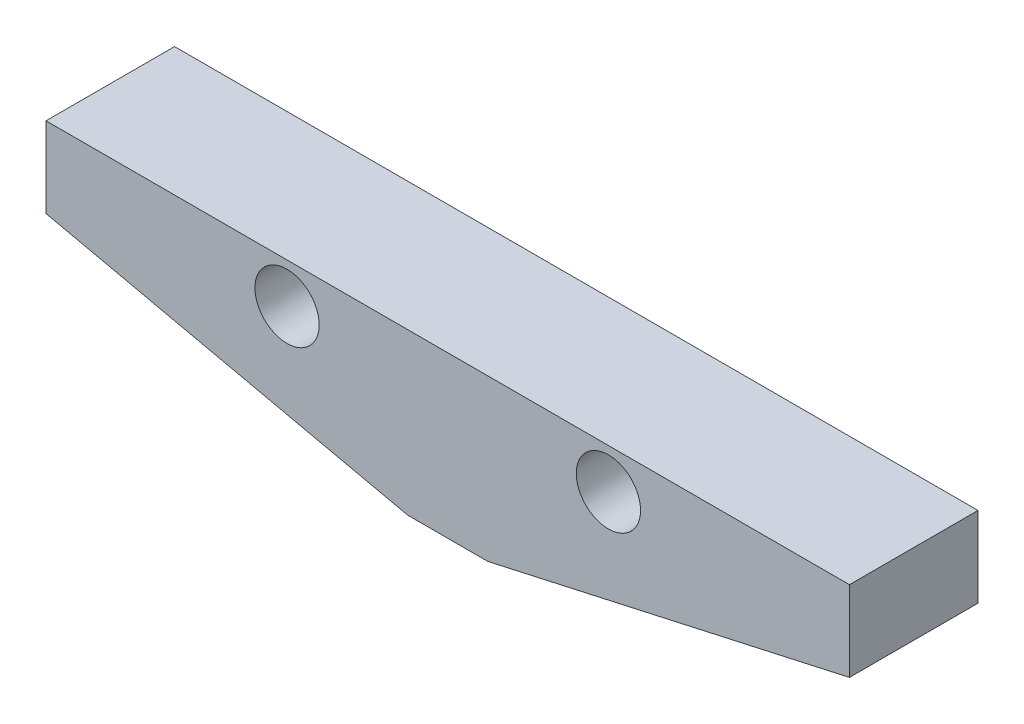
ISO-10303-21;
HEADER;
FILE_DESCRIPTION(('STEP AP214'),'2;1');
FILE_NAME('part.step','',(''),(''),'','','');
FILE_SCHEMA(('AUTOMOTIVE_DESIGN { 1 0 10303 214 1 1 1 1 }'));
ENDSEC;
DATA;
#1=APPLICATION_CONTEXT('core data for automotive mechanical design processes');
#2=APPLICATION_PROTOCOL_DEFINITION('international standard','automotive_design',2000,#1);
#3=PRODUCT_CONTEXT('',#1,'mechanical');
#4=PRODUCT('Part','Part','',(#3));
#5=PRODUCT_RELATED_PRODUCT_CATEGORY('part','',(#4));
#6=PRODUCT_DEFINITION_FORMATION('','',#4);
#7=PRODUCT_DEFINITION_CONTEXT('part definition',#1,'design');
#8=PRODUCT_DEFINITION('design','',#6,#7);
#9=PRODUCT_DEFINITION_SHAPE('','',#8);
#10=(LENGTH_UNIT() NAMED_UNIT(*) SI_UNIT(.MILLI.,.METRE.));
#11=(NAMED_UNIT(*) PLANE_ANGLE_UNIT() SI_UNIT($,.RADIAN.));
#12=(NAMED_UNIT(*) SI_UNIT($,.STERADIAN.) SOLID_ANGLE_UNIT());
#13=UNCERTAINTY_MEASURE_WITH_UNIT(LENGTH_MEASURE(1.E-05),#10,'distance_accuracy_value','');
#14=(GEOMETRIC_REPRESENTATION_CONTEXT(3) GLOBAL_UNCERTAINTY_ASSIGNED_CONTEXT((#13)) GLOBAL_UNIT_ASSIGNED_CONTEXT((#10,
#11,#12)) REPRESENTATION_CONTEXT('',''));
#15=CARTESIAN_POINT('',(0.,0.,0.));
#16=DIRECTION('',(0.,0.,1.));
#17=DIRECTION('',(1.,0.,0.));
#18=AXIS2_PLACEMENT_3D('',#15,#16,#17);
#19=CARTESIAN_POINT('',(9.14392772819499,11.2576306961008,0.));
#20=DIRECTION('',(0.,0.,1.));
#21=DIRECTION('',(1.,0.,0.));
#22=AXIS2_PLACEMENT_3D('',#19,#20,#21);
#23=CYLINDRICAL_SURFACE('',#22,1.25);
#24=CARTESIAN_POINT('',(9.14392772819499,11.2576306961008,0.));
#25=DIRECTION('',(0.,0.,1.));
#26=DIRECTION('',(1.,0.,0.));
#27=AXIS2_PLACEMENT_3D('',#24,#25,#26);
#28=CIRCLE('',#27,1.25);
#29=CARTESIAN_POINT('',(10.393927728195,11.2576306961008,0.));
#30=VERTEX_POINT('',#29);
#31=EDGE_CURVE('E137',#30,#30,#28,.T.);
#32=ORIENTED_EDGE('',*,*,#31,.F.);
#33=EDGE_LOOP('',(#32));
#34=FACE_BOUND('',#33,.T.);
#35=CARTESIAN_POINT('',(9.14392772819499,11.2576306961008,4.));
#36=DIRECTION('',(0.,0.,1.));
#37=DIRECTION('',(1.,0.,0.));
#38=AXIS2_PLACEMENT_3D('',#35,#36,#37);
#39=CIRCLE('',#38,1.25);
#40=CARTESIAN_POINT('',(10.393927728195,11.2576306961008,4.));
#41=VERTEX_POINT('',#40);
#42=EDGE_CURVE('E36',#41,#41,#39,.F.);
#43=ORIENTED_EDGE('',*,*,#42,.F.);
#44=EDGE_LOOP('',(#43));
#45=FACE_BOUND('',#44,.T.);
#46=ADVANCED_FACE('F32',(#34,#45),#23,.F.);
#47=CARTESIAN_POINT('',(-10.856072271805,11.2576306961008,0.));
#48=DIRECTION('',(0.,0.,1.));
#49=DIRECTION('',(1.,0.,0.));
#50=AXIS2_PLACEMENT_3D('',#47,#48,#49);
#51=CYLINDRICAL_SURFACE('',#50,1.25);
#52=CARTESIAN_POINT('',(-10.856072271805,11.2576306961008,0.));
#53=DIRECTION('',(0.,0.,1.));
#54=DIRECTION('',(1.,0.,0.));
#55=AXIS2_PLACEMENT_3D('',#52,#53,#54);
#56=CIRCLE('',#55,1.25);
#57=CARTESIAN_POINT('',(-9.60607227180502,11.2576306961008,0.));
#58=VERTEX_POINT('',#57);
#59=EDGE_CURVE('E123',#58,#58,#56,.T.);
#60=ORIENTED_EDGE('',*,*,#59,.F.);
#61=EDGE_LOOP('',(#60));
#62=FACE_BOUND('',#61,.T.);
#63=CARTESIAN_POINT('',(-10.856072271805,11.2576306961008,4.));
#64=DIRECTION('',(0.,0.,1.));
#65=DIRECTION('',(1.,0.,0.));
#66=AXIS2_PLACEMENT_3D('',#63,#64,#65);
#67=CIRCLE('',#66,1.25);
#68=CARTESIAN_POINT('',(-9.60607227180502,11.2576306961008,4.));
#69=VERTEX_POINT('',#68);
#70=EDGE_CURVE('E135',#69,#69,#67,.F.);
#71=ORIENTED_EDGE('',*,*,#70,.F.);
#72=EDGE_LOOP('',(#71));
#73=FACE_BOUND('',#72,.T.);
#74=ADVANCED_FACE('F179',(#62,#73),#51,.F.);
#75=CARTESIAN_POINT('',(-25.856072271805,8.75763069610085,8.));
#76=DIRECTION('',(1.,0.,0.));
#77=DIRECTION('',(0.,1.,0.));
#78=AXIS2_PLACEMENT_3D('',#75,#76,#77);
#79=PLANE('',#78);
#80=DIRECTION('',(0.,-1.,0.));
#81=VECTOR('',#80,1.);
#82=CARTESIAN_POINT('',(-25.856072271805,8.75763069610085,0.));
#83=LINE('',#82,#81);
#84=CARTESIAN_POINT('',(-25.856072271805,13.7576306961008,0.));
#85=VERTEX_POINT('',#84);
#86=CARTESIAN_POINT('',(-25.856072271805,8.75763069610085,0.));
#87=VERTEX_POINT('',#86);
#88=EDGE_CURVE('E119',#85,#87,#83,.T.);
#89=ORIENTED_EDGE('',*,*,#88,.T.);
#90=DIRECTION('',(0.,0.,-1.));
#91=VECTOR('',#90,1.);
#92=CARTESIAN_POINT('',(-25.856072271805,8.75763069610085,8.));
#93=LINE('',#92,#91);
#94=CARTESIAN_POINT('',(-25.856072271805,8.75763069610085,8.));
#95=VERTEX_POINT('',#94);
#96=EDGE_CURVE('E11',#95,#87,#93,.T.);
#97=ORIENTED_EDGE('',*,*,#96,.F.);
#98=DIRECTION('',(0.,-1.,0.));
#99=VECTOR('',#98,1.);
#100=CARTESIAN_POINT('',(-25.856072271805,8.75763069610085,8.));
#101=LINE('',#100,#99);
#102=CARTESIAN_POINT('',(-25.856072271805,13.7576306961008,8.));
#103=VERTEX_POINT('',#102);
#104=EDGE_CURVE('E130',#103,#95,#101,.T.);
#105=ORIENTED_EDGE('',*,*,#104,.F.);
#106=DIRECTION('',(0.,0.,-1.));
#107=VECTOR('',#106,1.);
#108=CARTESIAN_POINT('',(-25.856072271805,13.7576306961008,8.));
#109=LINE('',#108,#107);
#110=EDGE_CURVE('E115',#103,#85,#109,.T.);
#111=ORIENTED_EDGE('',*,*,#110,.T.);
#112=EDGE_LOOP('',(#89,#97,#105,#111));
#113=FACE_BOUND('',#112,.T.);
#114=ADVANCED_FACE('F34',(#113),#79,.F.);
#115=CARTESIAN_POINT('',(-3.35607227180501,3.75763069610085,8.));
#116=DIRECTION('',(0.216930457818656,0.976187060183953,0.));
#117=DIRECTION('',(-0.976187060183953,0.216930457818656,0.));
#118=AXIS2_PLACEMENT_3D('',#115,#116,#117);
#119=PLANE('',#118);
#120=DIRECTION('',(0.976187060183953,-0.216930457818656,0.));
#121=VECTOR('',#120,1.);
#122=CARTESIAN_POINT('',(-3.35607227180501,3.75763069610085,0.));
#123=LINE('',#122,#121);
#124=CARTESIAN_POINT('',(-3.35607227180501,3.75763069610085,0.));
#125=VERTEX_POINT('',#124);
#126=EDGE_CURVE('E122',#87,#125,#123,.T.);
#127=ORIENTED_EDGE('',*,*,#126,.T.);
#128=DIRECTION('',(0.,0.,-1.));
#129=VECTOR('',#128,1.);
#130=CARTESIAN_POINT('',(-3.35607227180501,3.75763069610085,8.));
#131=LINE('',#130,#129);
#132=CARTESIAN_POINT('',(-3.35607227180501,3.75763069610085,8.));
#133=VERTEX_POINT('',#132);
#134=EDGE_CURVE('E42',#133,#125,#131,.T.);
#135=ORIENTED_EDGE('',*,*,#134,.F.);
#136=DIRECTION('',(0.976187060183953,-0.216930457818656,0.));
#137=VECTOR('',#136,1.);
#138=CARTESIAN_POINT('',(-3.35607227180501,3.75763069610085,8.));
#139=LINE('',#138,#137);
#140=EDGE_CURVE('E88',#95,#133,#139,.T.);
#141=ORIENTED_EDGE('',*,*,#140,.F.);
#142=ORIENTED_EDGE('',*,*,#96,.T.);
#143=EDGE_LOOP('',(#127,#135,#141,#142));
#144=FACE_BOUND('',#143,.T.);
#145=ADVANCED_FACE('F159',(#144),#119,.F.);
#146=CARTESIAN_POINT('',(1.64392772819499,3.75763069610085,8.));
#147=DIRECTION('',(0.,1.,0.));
#148=DIRECTION('',(-1.,0.,0.));
#149=AXIS2_PLACEMENT_3D('',#146,#147,#148);
#150=PLANE('',#149);
#151=DIRECTION('',(1.,0.,0.));
#152=VECTOR('',#151,1.);
#153=CARTESIAN_POINT('',(1.64392772819499,3.75763069610085,0.));
#154=LINE('',#153,#152);
#155=CARTESIAN_POINT('',(1.64392772819499,3.75763069610085,0.));
#156=VERTEX_POINT('',#155);
#157=EDGE_CURVE('E125',#125,#156,#154,.T.);
#158=ORIENTED_EDGE('',*,*,#157,.T.);
#159=DIRECTION('',(0.,0.,-1.));
#160=VECTOR('',#159,1.);
#161=CARTESIAN_POINT('',(1.64392772819499,3.75763069610085,8.));
#162=LINE('',#161,#160);
#163=CARTESIAN_POINT('',(1.64392772819499,3.75763069610085,8.));
#164=VERTEX_POINT('',#163);
#165=EDGE_CURVE('E110',#164,#156,#162,.T.);
#166=ORIENTED_EDGE('',*,*,#165,.F.);
#167=DIRECTION('',(1.,0.,0.));
#168=VECTOR('',#167,1.);
#169=CARTESIAN_POINT('',(1.64392772819499,3.75763069610085,8.));
#170=LINE('',#169,#168);
#171=EDGE_CURVE('E101',#133,#164,#170,.T.);
#172=ORIENTED_EDGE('',*,*,#171,.F.);
#173=ORIENTED_EDGE('',*,*,#134,.T.);
#174=EDGE_LOOP('',(#158,#166,#172,#173));
#175=FACE_BOUND('',#174,.T.);
#176=ADVANCED_FACE('F162',(#175),#150,.F.);
#177=CARTESIAN_POINT('',(24.143927728195,8.75763069610085,8.));
#178=DIRECTION('',(-0.216930457818656,0.976187060183953,0.));
#179=DIRECTION('',(-0.976187060183953,-0.216930457818656,0.));
#180=AXIS2_PLACEMENT_3D('',#177,#178,#179);
#181=PLANE('',#180);
#182=DIRECTION('',(0.976187060183953,0.216930457818656,0.));
#183=VECTOR('',#182,1.);
#184=CARTESIAN_POINT('',(24.143927728195,8.75763069610085,0.));
#185=LINE('',#184,#183);
#186=CARTESIAN_POINT('',(24.143927728195,8.75763069610085,0.));
#187=VERTEX_POINT('',#186);
#188=EDGE_CURVE('E109',#156,#187,#185,.T.);
#189=ORIENTED_EDGE('',*,*,#188,.T.);
#190=DIRECTION('',(0.,0.,-1.));
#191=VECTOR('',#190,1.);
#192=CARTESIAN_POINT('',(24.143927728195,8.75763069610085,8.));
#193=LINE('',#192,#191);
#194=CARTESIAN_POINT('',(24.143927728195,8.75763069610085,8.));
#195=VERTEX_POINT('',#194);
#196=EDGE_CURVE('E106',#195,#187,#193,.T.);
#197=ORIENTED_EDGE('',*,*,#196,.F.);
#198=DIRECTION('',(0.976187060183953,0.216930457818656,0.));
#199=VECTOR('',#198,1.);
#200=CARTESIAN_POINT('',(24.143927728195,8.75763069610085,8.));
#201=LINE('',#200,#199);
#202=EDGE_CURVE('E95',#164,#195,#201,.T.);
#203=ORIENTED_EDGE('',*,*,#202,.F.);
#204=ORIENTED_EDGE('',*,*,#165,.T.);
#205=EDGE_LOOP('',(#189,#197,#203,#204));
#206=FACE_BOUND('',#205,.T.);
#207=ADVANCED_FACE('F107',(#206),#181,.F.);
#208=CARTESIAN_POINT('',(24.143927728195,13.7576306961008,8.));
#209=DIRECTION('',(-1.,0.,0.));
#210=DIRECTION('',(0.,-1.,0.));
#211=AXIS2_PLACEMENT_3D('',#208,#209,#210);
#212=PLANE('',#211);
#213=DIRECTION('',(0.,1.,0.));
#214=VECTOR('',#213,1.);
#215=CARTESIAN_POINT('',(24.143927728195,13.7576306961008,0.));
#216=LINE('',#215,#214);
#217=CARTESIAN_POINT('',(24.143927728195,13.7576306961008,0.));
#218=VERTEX_POINT('',#217);
#219=EDGE_CURVE('E74',#187,#218,#216,.T.);
#220=ORIENTED_EDGE('',*,*,#219,.T.);
#221=DIRECTION('',(0.,0.,-1.));
#222=VECTOR('',#221,1.);
#223=CARTESIAN_POINT('',(24.143927728195,13.7576306961008,8.));
#224=LINE('',#223,#222);
#225=CARTESIAN_POINT('',(24.143927728195,13.7576306961008,8.));
#226=VERTEX_POINT('',#225);
#227=EDGE_CURVE('E111',#226,#218,#224,.T.);
#228=ORIENTED_EDGE('',*,*,#227,.F.);
#229=DIRECTION('',(0.,1.,0.));
#230=VECTOR('',#229,1.);
#231=CARTESIAN_POINT('',(24.143927728195,13.7576306961008,8.));
#232=LINE('',#231,#230);
#233=EDGE_CURVE('E99',#195,#226,#232,.T.);
#234=ORIENTED_EDGE('',*,*,#233,.F.);
#235=ORIENTED_EDGE('',*,*,#196,.T.);
#236=EDGE_LOOP('',(#220,#228,#234,#235));
#237=FACE_BOUND('',#236,.T.);
#238=ADVANCED_FACE('F113',(#237),#212,.F.);
#239=CARTESIAN_POINT('',(-25.856072271805,13.7576306961008,8.));
#240=DIRECTION('',(0.,-1.,0.));
#241=DIRECTION('',(0.,0.,-1.));
#242=AXIS2_PLACEMENT_3D('',#239,#240,#241);
#243=PLANE('',#242);
#244=DIRECTION('',(-1.,0.,0.));
#245=VECTOR('',#244,1.);
#246=CARTESIAN_POINT('',(-25.856072271805,13.7576306961008,0.));
#247=LINE('',#246,#245);
#248=EDGE_CURVE('E80',#218,#85,#247,.T.);
#249=ORIENTED_EDGE('',*,*,#248,.T.);
#250=ORIENTED_EDGE('',*,*,#110,.F.);
#251=DIRECTION('',(-1.,0.,0.));
#252=VECTOR('',#251,1.);
#253=CARTESIAN_POINT('',(-25.856072271805,13.7576306961008,8.));
#254=LINE('',#253,#252);
#255=EDGE_CURVE('E51',#226,#103,#254,.T.);
#256=ORIENTED_EDGE('',*,*,#255,.F.);
#257=ORIENTED_EDGE('',*,*,#227,.T.);
#258=EDGE_LOOP('',(#249,#250,#256,#257));
#259=FACE_BOUND('',#258,.T.);
#260=ADVANCED_FACE('F167',(#259),#243,.F.);
#261=CARTESIAN_POINT('',(0.,0.,8.));
#262=DIRECTION('',(0.,0.,-1.));
#263=DIRECTION('',(-1.,0.,0.));
#264=AXIS2_PLACEMENT_3D('',#261,#262,#263);
#265=PLANE('',#264);
#266=CARTESIAN_POINT('',(9.14392772819499,11.2576306961008,8.));
#267=DIRECTION('',(0.,0.,1.));
#268=DIRECTION('',(1.,0.,0.));
#269=AXIS2_PLACEMENT_3D('',#266,#267,#268);
#270=CIRCLE('',#269,2.);
#271=CARTESIAN_POINT('',(11.143927728195,11.2576306961008,8.));
#272=VERTEX_POINT('',#271);
#273=EDGE_CURVE('E151',#272,#272,#270,.T.);
#274=ORIENTED_EDGE('',*,*,#273,.F.);
#275=EDGE_LOOP('',(#274));
#276=FACE_BOUND('',#275,.T.);
#277=CARTESIAN_POINT('',(-10.856072271805,11.2576306961008,8.));
#278=DIRECTION('',(0.,0.,1.));
#279=DIRECTION('',(1.,0.,0.));
#280=AXIS2_PLACEMENT_3D('',#277,#278,#279);
#281=CIRCLE('',#280,2.);
#282=CARTESIAN_POINT('',(-8.85607227180501,11.2576306961008,8.));
#283=VERTEX_POINT('',#282);
#284=EDGE_CURVE('E144',#283,#283,#281,.T.);
#285=ORIENTED_EDGE('',*,*,#284,.F.);
#286=EDGE_LOOP('',(#285));
#287=FACE_BOUND('',#286,.T.);
#288=ORIENTED_EDGE('',*,*,#104,.T.);
#289=ORIENTED_EDGE('',*,*,#140,.T.);
#290=ORIENTED_EDGE('',*,*,#171,.T.);
#291=ORIENTED_EDGE('',*,*,#202,.T.);
#292=ORIENTED_EDGE('',*,*,#233,.T.);
#293=ORIENTED_EDGE('',*,*,#255,.T.);
#294=EDGE_LOOP('',(#288,#289,#290,#291,#292,#293));
#295=FACE_BOUND('',#294,.T.);
#296=ADVANCED_FACE('F97',(#276,#287,#295),#265,.F.);
#297=CARTESIAN_POINT('',(0.,0.,0.));
#298=DIRECTION('',(0.,0.,-1.));
#299=DIRECTION('',(-1.,0.,0.));
#300=AXIS2_PLACEMENT_3D('',#297,#298,#299);
#301=PLANE('',#300);
#302=ORIENTED_EDGE('',*,*,#31,.T.);
#303=EDGE_LOOP('',(#302));
#304=FACE_BOUND('',#303,.T.);
#305=ORIENTED_EDGE('',*,*,#59,.T.);
#306=EDGE_LOOP('',(#305));
#307=FACE_BOUND('',#306,.T.);
#308=ORIENTED_EDGE('',*,*,#88,.F.);
#309=ORIENTED_EDGE('',*,*,#248,.F.);
#310=ORIENTED_EDGE('',*,*,#219,.F.);
#311=ORIENTED_EDGE('',*,*,#188,.F.);
#312=ORIENTED_EDGE('',*,*,#157,.F.);
#313=ORIENTED_EDGE('',*,*,#126,.F.);
#314=EDGE_LOOP('',(#308,#309,#310,#311,#312,#313));
#315=FACE_BOUND('',#314,.T.);
#316=ADVANCED_FACE('F165',(#304,#307,#315),#301,.T.);
#317=CARTESIAN_POINT('',(-10.856072271805,11.2576306961008,4.));
#318=DIRECTION('',(0.,0.,1.));
#319=DIRECTION('',(1.,0.,0.));
#320=AXIS2_PLACEMENT_3D('',#317,#318,#319);
#321=PLANE('',#320);
#322=CARTESIAN_POINT('',(-10.856072271805,11.2576306961008,4.));
#323=DIRECTION('',(0.,0.,1.));
#324=DIRECTION('',(1.,0.,0.));
#325=AXIS2_PLACEMENT_3D('',#322,#323,#324);
#326=CIRCLE('',#325,2.);
#327=CARTESIAN_POINT('',(-8.85607227180501,11.2576306961008,4.));
#328=VERTEX_POINT('',#327);
#329=EDGE_CURVE('E138',#328,#328,#326,.T.);
#330=ORIENTED_EDGE('',*,*,#329,.T.);
#331=EDGE_LOOP('',(#330));
#332=FACE_BOUND('',#331,.T.);
#333=ORIENTED_EDGE('',*,*,#70,.T.);
#334=EDGE_LOOP('',(#333));
#335=FACE_BOUND('',#334,.T.);
#336=ADVANCED_FACE('F193',(#332,#335),#321,.T.);
#337=CARTESIAN_POINT('',(-10.856072271805,11.2576306961008,4.));
#338=DIRECTION('',(0.,0.,1.));
#339=DIRECTION('',(1.,0.,0.));
#340=AXIS2_PLACEMENT_3D('',#337,#338,#339);
#341=CYLINDRICAL_SURFACE('',#340,2.);
#342=ORIENTED_EDGE('',*,*,#329,.F.);
#343=EDGE_LOOP('',(#342));
#344=FACE_BOUND('',#343,.T.);
#345=ORIENTED_EDGE('',*,*,#284,.T.);
#346=EDGE_LOOP('',(#345));
#347=FACE_BOUND('',#346,.T.);
#348=ADVANCED_FACE('F190',(#344,#347),#341,.F.);
#349=CARTESIAN_POINT('',(9.14392772819499,11.2576306961008,4.));
#350=DIRECTION('',(0.,0.,1.));
#351=DIRECTION('',(1.,0.,0.));
#352=AXIS2_PLACEMENT_3D('',#349,#350,#351);
#353=PLANE('',#352);
#354=CARTESIAN_POINT('',(9.14392772819499,11.2576306961008,4.));
#355=DIRECTION('',(0.,0.,1.));
#356=DIRECTION('',(1.,0.,0.));
#357=AXIS2_PLACEMENT_3D('',#354,#355,#356);
#358=CIRCLE('',#357,2.);
#359=CARTESIAN_POINT('',(11.143927728195,11.2576306961008,4.));
#360=VERTEX_POINT('',#359);
#361=EDGE_CURVE('E218',#360,#360,#358,.T.);
#362=ORIENTED_EDGE('',*,*,#361,.T.);
#363=EDGE_LOOP('',(#362));
#364=FACE_BOUND('',#363,.T.);
#365=ORIENTED_EDGE('',*,*,#42,.T.);
#366=EDGE_LOOP('',(#365));
#367=FACE_BOUND('',#366,.T.);
#368=ADVANCED_FACE('F204',(#364,#367),#353,.T.);
#369=CARTESIAN_POINT('',(9.14392772819499,11.2576306961008,4.));
#370=DIRECTION('',(0.,0.,1.));
#371=DIRECTION('',(1.,0.,0.));
#372=AXIS2_PLACEMENT_3D('',#369,#370,#371);
#373=CYLINDRICAL_SURFACE('',#372,2.);
#374=ORIENTED_EDGE('',*,*,#361,.F.);
#375=EDGE_LOOP('',(#374));
#376=FACE_BOUND('',#375,.T.);
#377=ORIENTED_EDGE('',*,*,#273,.T.);
#378=EDGE_LOOP('',(#377));
#379=FACE_BOUND('',#378,.T.);
#380=ADVANCED_FACE('F207',(#376,#379),#373,.F.);
#381=CLOSED_SHELL('',(#46,#74,#114,#145,#176,#207,#238,#260,#296,#316,#336,#348,#368,#380));
#382=MANIFOLD_SOLID_BREP('B2',#381);
#383=ADVANCED_BREP_SHAPE_REPRESENTATION('',(#18,#382),#14);
#384=SHAPE_DEFINITION_REPRESENTATION(#9,#383);
ENDSEC;
END-ISO-10303-21;
